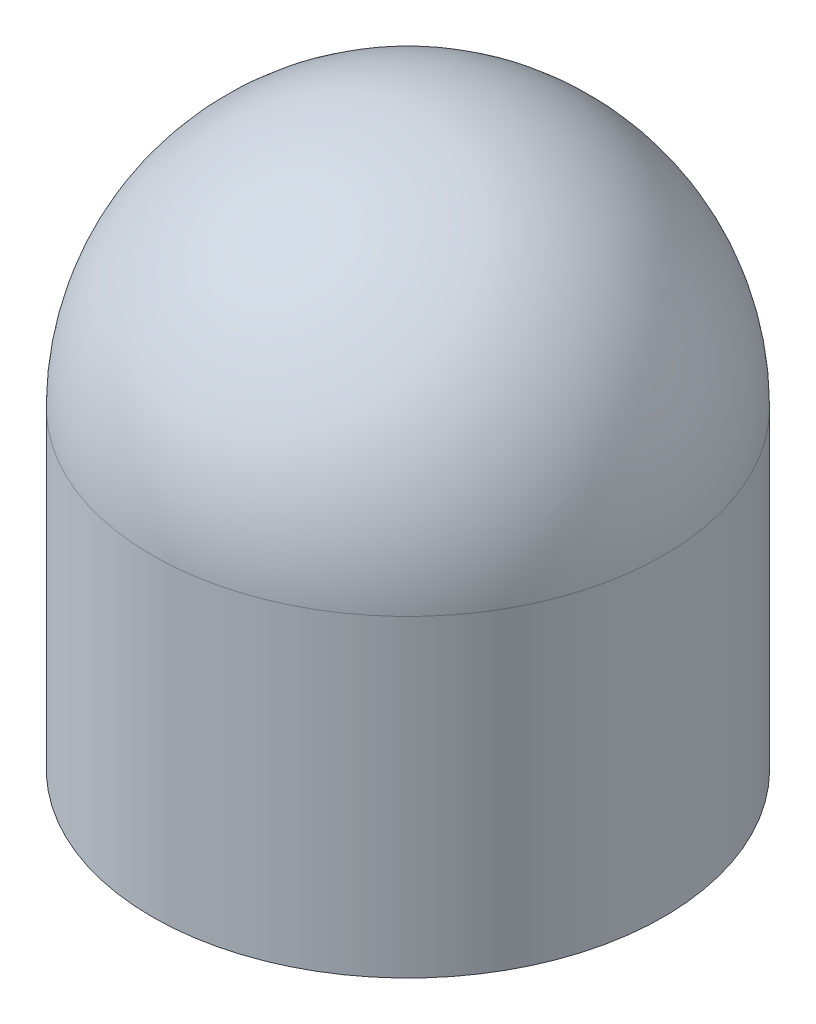
ISO-10303-21;
HEADER;
FILE_DESCRIPTION(('STEP AP214'),'2;1');
FILE_NAME('part.step','',(''),(''),'','','');
FILE_SCHEMA(('AUTOMOTIVE_DESIGN { 1 0 10303 214 1 1 1 1 }'));
ENDSEC;
DATA;
#1=APPLICATION_CONTEXT('core data for automotive mechanical design processes');
#2=APPLICATION_PROTOCOL_DEFINITION('international standard','automotive_design',2000,#1);
#3=PRODUCT_CONTEXT('',#1,'mechanical');
#4=PRODUCT('Part','Part','',(#3));
#5=PRODUCT_RELATED_PRODUCT_CATEGORY('part','',(#4));
#6=PRODUCT_DEFINITION_FORMATION('','',#4);
#7=PRODUCT_DEFINITION_CONTEXT('part definition',#1,'design');
#8=PRODUCT_DEFINITION('design','',#6,#7);
#9=PRODUCT_DEFINITION_SHAPE('','',#8);
#10=(LENGTH_UNIT() NAMED_UNIT(*) SI_UNIT(.MILLI.,.METRE.));
#11=(NAMED_UNIT(*) PLANE_ANGLE_UNIT() SI_UNIT($,.RADIAN.));
#12=(NAMED_UNIT(*) SI_UNIT($,.STERADIAN.) SOLID_ANGLE_UNIT());
#13=UNCERTAINTY_MEASURE_WITH_UNIT(LENGTH_MEASURE(1.E-05),#10,'distance_accuracy_value','');
#14=(GEOMETRIC_REPRESENTATION_CONTEXT(3) GLOBAL_UNCERTAINTY_ASSIGNED_CONTEXT((#13)) GLOBAL_UNIT_ASSIGNED_CONTEXT((#10,
#11,#12)) REPRESENTATION_CONTEXT('',''));
#15=CARTESIAN_POINT('',(0.,0.,0.));
#16=DIRECTION('',(0.,0.,1.));
#17=DIRECTION('',(1.,0.,0.));
#18=AXIS2_PLACEMENT_3D('',#15,#16,#17);
#19=CARTESIAN_POINT('',(0.,30.,0.));
#20=DIRECTION('',(0.,-1.,0.));
#21=DIRECTION('',(0.,0.,-1.));
#22=AXIS2_PLACEMENT_3D('',#19,#20,#21);
#23=CYLINDRICAL_SURFACE('',#22,24.5);
#24=CARTESIAN_POINT('',(0.,30.,0.));
#25=DIRECTION('',(0.,1.,0.));
#26=DIRECTION('',(0.,0.,1.));
#27=AXIS2_PLACEMENT_3D('',#24,#25,#26);
#28=CIRCLE('',#27,24.5);
#29=CARTESIAN_POINT('',(0.,30.,24.5));
#30=VERTEX_POINT('',#29);
#31=EDGE_CURVE('E10',#30,#30,#28,.T.);
#32=ORIENTED_EDGE('',*,*,#31,.F.);
#33=EDGE_LOOP('',(#32));
#34=FACE_BOUND('',#33,.T.);
#35=CARTESIAN_POINT('',(0.,0.,0.));
#36=DIRECTION('',(0.,1.,0.));
#37=DIRECTION('',(0.,0.,1.));
#38=AXIS2_PLACEMENT_3D('',#35,#36,#37);
#39=CIRCLE('',#38,24.5);
#40=CARTESIAN_POINT('',(0.,0.,24.5));
#41=VERTEX_POINT('',#40);
#42=EDGE_CURVE('E42',#41,#41,#39,.T.);
#43=ORIENTED_EDGE('',*,*,#42,.T.);
#44=EDGE_LOOP('',(#43));
#45=FACE_BOUND('',#44,.T.);
#46=ADVANCED_FACE('F39',(#34,#45),#23,.T.);
#47=CARTESIAN_POINT('',(0.,0.,0.));
#48=DIRECTION('',(0.,1.,0.));
#49=DIRECTION('',(0.,0.,1.));
#50=AXIS2_PLACEMENT_3D('',#47,#48,#49);
#51=PLANE('',#50);
#52=CARTESIAN_POINT('',(0.,0.,0.));
#53=DIRECTION('',(0.,-1.,0.));
#54=DIRECTION('',(0.,0.,-1.));
#55=AXIS2_PLACEMENT_3D('',#52,#53,#54);
#56=CIRCLE('',#55,22.9);
#57=CARTESIAN_POINT('',(0.,0.,-22.9));
#58=VERTEX_POINT('',#57);
#59=EDGE_CURVE('E54',#58,#58,#56,.T.);
#60=ORIENTED_EDGE('',*,*,#59,.F.);
#61=EDGE_LOOP('',(#60));
#62=FACE_BOUND('',#61,.T.);
#63=ORIENTED_EDGE('',*,*,#42,.F.);
#64=EDGE_LOOP('',(#63));
#65=FACE_BOUND('',#64,.T.);
#66=ADVANCED_FACE('F70',(#62,#65),#51,.F.);
#67=CARTESIAN_POINT('',(0.,30.,0.));
#68=DIRECTION('',(1.,0.,0.));
#69=DIRECTION('',(0.,0.,1.));
#70=AXIS2_PLACEMENT_3D('',#67,#68,#69);
#71=SPHERICAL_SURFACE('',#70,24.5);
#72=CARTESIAN_POINT('',(0.,30.,0.));
#73=DIRECTION('',(0.,1.,0.));
#74=DIRECTION('',(0.,0.,1.));
#75=AXIS2_PLACEMENT_3D('',#72,#73,#74);
#76=SPHERICAL_SURFACE('',#75,24.5);
#77=ORIENTED_EDGE('',*,*,#31,.T.);
#78=EDGE_LOOP('',(#77));
#79=FACE_BOUND('',#78,.T.);
#80=ADVANCED_FACE('F73',(#79),#76,.T.);
#81=CARTESIAN_POINT('',(0.,30.,0.));
#82=DIRECTION('',(0.,-1.,0.));
#83=DIRECTION('',(0.,0.,-1.));
#84=AXIS2_PLACEMENT_3D('',#81,#82,#83);
#85=PLANE('',#84);
#86=CARTESIAN_POINT('',(0.,30.,0.));
#87=DIRECTION('',(0.,-1.,0.));
#88=DIRECTION('',(0.,0.,-1.));
#89=AXIS2_PLACEMENT_3D('',#86,#87,#88);
#90=CIRCLE('',#89,22.9);
#91=CARTESIAN_POINT('',(0.,30.,-22.9));
#92=VERTEX_POINT('',#91);
#93=EDGE_CURVE('E53',#92,#92,#90,.T.);
#94=ORIENTED_EDGE('',*,*,#93,.T.);
#95=EDGE_LOOP('',(#94));
#96=FACE_BOUND('',#95,.T.);
#97=CARTESIAN_POINT('',(0.,30.,0.));
#98=DIRECTION('',(0.,-1.,0.));
#99=DIRECTION('',(0.,0.,-1.));
#100=AXIS2_PLACEMENT_3D('',#97,#98,#99);
#101=CIRCLE('',#100,22.5);
#102=CARTESIAN_POINT('',(0.,30.,-22.5));
#103=VERTEX_POINT('',#102);
#104=EDGE_CURVE('E49',#103,#103,#101,.F.);
#105=ORIENTED_EDGE('',*,*,#104,.T.);
#106=EDGE_LOOP('',(#105));
#107=FACE_BOUND('',#106,.T.);
#108=ADVANCED_FACE('F60',(#96,#107),#85,.T.);
#109=CARTESIAN_POINT('',(0.,30.,0.));
#110=DIRECTION('',(0.,-1.,0.));
#111=DIRECTION('',(0.,0.,-1.));
#112=AXIS2_PLACEMENT_3D('',#109,#110,#111);
#113=CYLINDRICAL_SURFACE('',#112,22.9);
#114=ORIENTED_EDGE('',*,*,#93,.F.);
#115=EDGE_LOOP('',(#114));
#116=FACE_BOUND('',#115,.T.);
#117=ORIENTED_EDGE('',*,*,#59,.T.);
#118=EDGE_LOOP('',(#117));
#119=FACE_BOUND('',#118,.T.);
#120=ADVANCED_FACE('F63',(#116,#119),#113,.F.);
#121=CARTESIAN_POINT('',(0.,30.,0.));
#122=DIRECTION('',(1.,0.,0.));
#123=DIRECTION('',(0.,0.,1.));
#124=AXIS2_PLACEMENT_3D('',#121,#122,#123);
#125=SPHERICAL_SURFACE('',#124,22.5);
#126=CARTESIAN_POINT('',(0.,30.,0.));
#127=DIRECTION('',(0.,-1.,0.));
#128=DIRECTION('',(0.,0.,-1.));
#129=AXIS2_PLACEMENT_3D('',#126,#127,#128);
#130=SPHERICAL_SURFACE('',#129,22.5);
#131=ORIENTED_EDGE('',*,*,#104,.F.);
#132=EDGE_LOOP('',(#131));
#133=FACE_BOUND('',#132,.T.);
#134=ADVANCED_FACE('F66',(#133),#130,.F.);
#135=CLOSED_SHELL('',(#46,#66,#80,#108,#120,#134));
#136=MANIFOLD_SOLID_BREP('B2',#135);
#137=ADVANCED_BREP_SHAPE_REPRESENTATION('',(#18,#136),#14);
#138=SHAPE_DEFINITION_REPRESENTATION(#9,#137);
ENDSEC;
END-ISO-10303-21;
